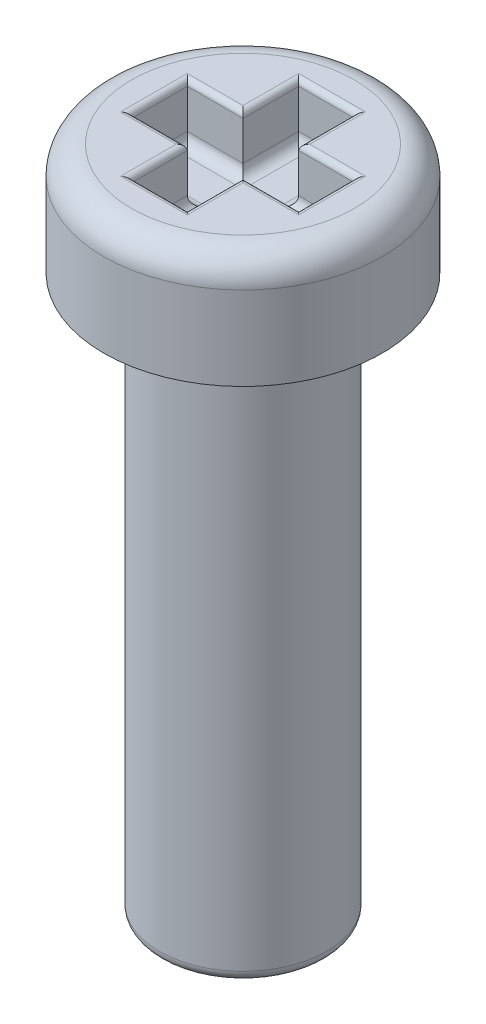
ISO-10303-21;
HEADER;
FILE_DESCRIPTION(('STEP AP214'),'2;1');
FILE_NAME('part.step','',(''),(''),'','','');
FILE_SCHEMA(('AUTOMOTIVE_DESIGN { 1 0 10303 214 1 1 1 1 }'));
ENDSEC;
DATA;
#1=APPLICATION_CONTEXT('core data for automotive mechanical design processes');
#2=APPLICATION_PROTOCOL_DEFINITION('international standard','automotive_design',2000,#1);
#3=PRODUCT_CONTEXT('',#1,'mechanical');
#4=PRODUCT('Part','Part','',(#3));
#5=PRODUCT_RELATED_PRODUCT_CATEGORY('part','',(#4));
#6=PRODUCT_DEFINITION_FORMATION('','',#4);
#7=PRODUCT_DEFINITION_CONTEXT('part definition',#1,'design');
#8=PRODUCT_DEFINITION('design','',#6,#7);
#9=PRODUCT_DEFINITION_SHAPE('','',#8);
#10=(LENGTH_UNIT() NAMED_UNIT(*) SI_UNIT(.MILLI.,.METRE.));
#11=(NAMED_UNIT(*) PLANE_ANGLE_UNIT() SI_UNIT($,.RADIAN.));
#12=(NAMED_UNIT(*) SI_UNIT($,.STERADIAN.) SOLID_ANGLE_UNIT());
#13=UNCERTAINTY_MEASURE_WITH_UNIT(LENGTH_MEASURE(1.E-05),#10,'distance_accuracy_value','');
#14=(GEOMETRIC_REPRESENTATION_CONTEXT(3) GLOBAL_UNCERTAINTY_ASSIGNED_CONTEXT((#13)) GLOBAL_UNIT_ASSIGNED_CONTEXT((#10,
#11,#12)) REPRESENTATION_CONTEXT('',''));
#15=CARTESIAN_POINT('',(0.,0.,0.));
#16=DIRECTION('',(0.,0.,1.));
#17=DIRECTION('',(1.,0.,0.));
#18=AXIS2_PLACEMENT_3D('',#15,#16,#17);
#19=CARTESIAN_POINT('',(0.,10.,0.));
#20=DIRECTION('',(0.,-1.,0.));
#21=DIRECTION('',(0.,0.,-1.));
#22=AXIS2_PLACEMENT_3D('',#19,#20,#21);
#23=CYLINDRICAL_SURFACE('',#22,1.5);
#24=CARTESIAN_POINT('',(0.,0.200000000000001,0.));
#25=DIRECTION('',(0.,1.,0.));
#26=DIRECTION('',(0.,0.,1.));
#27=AXIS2_PLACEMENT_3D('',#24,#25,#26);
#28=CIRCLE('',#27,1.5);
#29=CARTESIAN_POINT('',(0.,0.200000000000001,1.5));
#30=VERTEX_POINT('',#29);
#31=EDGE_CURVE('E255',#30,#30,#28,.T.);
#32=ORIENTED_EDGE('',*,*,#31,.T.);
#33=EDGE_LOOP('',(#32));
#34=FACE_BOUND('',#33,.T.);
#35=CARTESIAN_POINT('',(0.,10.,0.));
#36=DIRECTION('',(0.,1.,0.));
#37=DIRECTION('',(0.,0.,1.));
#38=AXIS2_PLACEMENT_3D('',#35,#36,#37);
#39=CIRCLE('',#38,1.5);
#40=CARTESIAN_POINT('',(0.,10.,1.5));
#41=VERTEX_POINT('',#40);
#42=EDGE_CURVE('E626',#41,#41,#39,.T.);
#43=ORIENTED_EDGE('',*,*,#42,.F.);
#44=EDGE_LOOP('',(#43));
#45=FACE_BOUND('',#44,.T.);
#46=ADVANCED_FACE('F40',(#34,#45),#23,.T.);
#47=CARTESIAN_POINT('',(0.,0.,0.));
#48=DIRECTION('',(0.,1.,0.));
#49=DIRECTION('',(0.,0.,1.));
#50=AXIS2_PLACEMENT_3D('',#47,#48,#49);
#51=PLANE('',#50);
#52=CARTESIAN_POINT('',(0.,0.,0.));
#53=DIRECTION('',(0.,1.,0.));
#54=DIRECTION('',(0.,0.,1.));
#55=AXIS2_PLACEMENT_3D('',#52,#53,#54);
#56=CIRCLE('',#55,1.3);
#57=CARTESIAN_POINT('',(0.,0.,1.3));
#58=VERTEX_POINT('',#57);
#59=EDGE_CURVE('E246',#58,#58,#56,.F.);
#60=ORIENTED_EDGE('',*,*,#59,.T.);
#61=EDGE_LOOP('',(#60));
#62=FACE_BOUND('',#61,.T.);
#63=ADVANCED_FACE('F500',(#62),#51,.F.);
#64=CARTESIAN_POINT('',(0.,0.200000000000001,0.));
#65=DIRECTION('',(0.,1.,0.));
#66=DIRECTION('',(0.,0.,1.));
#67=AXIS2_PLACEMENT_3D('',#64,#65,#66);
#68=TOROIDAL_SURFACE('',#67,1.3,0.2);
#69=ORIENTED_EDGE('',*,*,#59,.F.);
#70=EDGE_LOOP('',(#69));
#71=FACE_BOUND('',#70,.T.);
#72=ORIENTED_EDGE('',*,*,#31,.F.);
#73=EDGE_LOOP('',(#72));
#74=FACE_BOUND('',#73,.T.);
#75=ADVANCED_FACE('F506',(#71,#74),#68,.T.);
#76=CARTESIAN_POINT('',(0.,10.,0.));
#77=DIRECTION('',(0.,1.,0.));
#78=DIRECTION('',(0.,0.,1.));
#79=AXIS2_PLACEMENT_3D('',#76,#77,#78);
#80=PLANE('',#79);
#81=ORIENTED_EDGE('',*,*,#42,.T.);
#82=EDGE_LOOP('',(#81));
#83=FACE_BOUND('',#82,.T.);
#84=CARTESIAN_POINT('',(0.,10.,0.));
#85=DIRECTION('',(0.,-1.,0.));
#86=DIRECTION('',(0.,0.,-1.));
#87=AXIS2_PLACEMENT_3D('',#84,#85,#86);
#88=CIRCLE('',#87,2.5);
#89=CARTESIAN_POINT('',(0.,10.,-2.5));
#90=VERTEX_POINT('',#89);
#91=EDGE_CURVE('E622',#90,#90,#88,.T.);
#92=ORIENTED_EDGE('',*,*,#91,.T.);
#93=EDGE_LOOP('',(#92));
#94=FACE_BOUND('',#93,.T.);
#95=ADVANCED_FACE('F515',(#83,#94),#80,.F.);
#96=CARTESIAN_POINT('',(0.,0.,0.));
#97=DIRECTION('',(0.,-1.,0.));
#98=DIRECTION('',(0.,0.,-1.));
#99=AXIS2_PLACEMENT_3D('',#96,#97,#98);
#100=CYLINDRICAL_SURFACE('',#99,2.5);
#101=CARTESIAN_POINT('',(0.,11.5,0.));
#102=DIRECTION('',(0.,-1.,0.));
#103=DIRECTION('',(0.,0.,-1.));
#104=AXIS2_PLACEMENT_3D('',#101,#102,#103);
#105=CIRCLE('',#104,2.5);
#106=CARTESIAN_POINT('',(0.,11.5,-2.5));
#107=VERTEX_POINT('',#106);
#108=EDGE_CURVE('E49',#107,#107,#105,.T.);
#109=ORIENTED_EDGE('',*,*,#108,.T.);
#110=EDGE_LOOP('',(#109));
#111=FACE_BOUND('',#110,.T.);
#112=ORIENTED_EDGE('',*,*,#91,.F.);
#113=EDGE_LOOP('',(#112));
#114=FACE_BOUND('',#113,.T.);
#115=ADVANCED_FACE('F486',(#111,#114),#100,.T.);
#116=CARTESIAN_POINT('',(-2.5,12.,0.));
#117=DIRECTION('',(0.,-1.,0.));
#118=DIRECTION('',(0.,0.,-1.));
#119=AXIS2_PLACEMENT_3D('',#116,#117,#118);
#120=PLANE('',#119);
#121=CARTESIAN_POINT('',(0.,12.,0.));
#122=DIRECTION('',(0.,-1.,0.));
#123=DIRECTION('',(0.,0.,-1.));
#124=AXIS2_PLACEMENT_3D('',#121,#122,#123);
#125=CIRCLE('',#124,2.);
#126=CARTESIAN_POINT('',(0.,12.,-2.));
#127=VERTEX_POINT('',#126);
#128=EDGE_CURVE('E11',#127,#127,#125,.F.);
#129=ORIENTED_EDGE('',*,*,#128,.T.);
#130=EDGE_LOOP('',(#129));
#131=FACE_BOUND('',#130,.T.);
#132=DIRECTION('',(0.,0.,1.));
#133=VECTOR('',#132,1.);
#134=CARTESIAN_POINT('',(-0.6,12.,0.));
#135=LINE('',#134,#133);
#136=CARTESIAN_POINT('',(-0.6,12.,1.6));
#137=VERTEX_POINT('',#136);
#138=CARTESIAN_POINT('',(-0.6,12.,0.6));
#139=VERTEX_POINT('',#138);
#140=EDGE_CURVE('E284',#137,#139,#135,.F.);
#141=ORIENTED_EDGE('',*,*,#140,.T.);
#142=DIRECTION('',(1.,0.,0.));
#143=VECTOR('',#142,1.);
#144=CARTESIAN_POINT('',(-2.5,12.,0.6));
#145=LINE('',#144,#143);
#146=CARTESIAN_POINT('',(-1.6,12.,0.6));
#147=VERTEX_POINT('',#146);
#148=EDGE_CURVE('E227',#139,#147,#145,.F.);
#149=ORIENTED_EDGE('',*,*,#148,.T.);
#150=DIRECTION('',(0.,0.,1.));
#151=VECTOR('',#150,1.);
#152=CARTESIAN_POINT('',(-1.6,12.,0.));
#153=LINE('',#152,#151);
#154=CARTESIAN_POINT('',(-1.6,12.,-0.6));
#155=VERTEX_POINT('',#154);
#156=EDGE_CURVE('E245',#147,#155,#153,.F.);
#157=ORIENTED_EDGE('',*,*,#156,.T.);
#158=DIRECTION('',(-1.,0.,0.));
#159=VECTOR('',#158,1.);
#160=CARTESIAN_POINT('',(-2.5,12.,-0.6));
#161=LINE('',#160,#159);
#162=CARTESIAN_POINT('',(-0.6,12.,-0.6));
#163=VERTEX_POINT('',#162);
#164=EDGE_CURVE('E251',#155,#163,#161,.F.);
#165=ORIENTED_EDGE('',*,*,#164,.T.);
#166=DIRECTION('',(0.,0.,1.));
#167=VECTOR('',#166,1.);
#168=CARTESIAN_POINT('',(-0.6,12.,0.));
#169=LINE('',#168,#167);
#170=CARTESIAN_POINT('',(-0.6,12.,-1.6));
#171=VERTEX_POINT('',#170);
#172=EDGE_CURVE('E261',#163,#171,#169,.F.);
#173=ORIENTED_EDGE('',*,*,#172,.T.);
#174=DIRECTION('',(-1.,0.,0.));
#175=VECTOR('',#174,1.);
#176=CARTESIAN_POINT('',(-2.5,12.,-1.6));
#177=LINE('',#176,#175);
#178=CARTESIAN_POINT('',(0.6,12.,-1.6));
#179=VERTEX_POINT('',#178);
#180=EDGE_CURVE('E264',#171,#179,#177,.F.);
#181=ORIENTED_EDGE('',*,*,#180,.T.);
#182=DIRECTION('',(0.,0.,-1.));
#183=VECTOR('',#182,1.);
#184=CARTESIAN_POINT('',(0.6,12.,0.));
#185=LINE('',#184,#183);
#186=CARTESIAN_POINT('',(0.6,12.,-0.6));
#187=VERTEX_POINT('',#186);
#188=EDGE_CURVE('E266',#179,#187,#185,.F.);
#189=ORIENTED_EDGE('',*,*,#188,.T.);
#190=DIRECTION('',(-1.,0.,0.));
#191=VECTOR('',#190,1.);
#192=CARTESIAN_POINT('',(-2.5,12.,-0.599999999999999));
#193=LINE('',#192,#191);
#194=CARTESIAN_POINT('',(1.6,12.,-0.6));
#195=VERTEX_POINT('',#194);
#196=EDGE_CURVE('E269',#187,#195,#193,.F.);
#197=ORIENTED_EDGE('',*,*,#196,.T.);
#198=DIRECTION('',(0.,0.,-1.));
#199=VECTOR('',#198,1.);
#200=CARTESIAN_POINT('',(1.6,12.,0.));
#201=LINE('',#200,#199);
#202=CARTESIAN_POINT('',(1.6,12.,0.6));
#203=VERTEX_POINT('',#202);
#204=EDGE_CURVE('E272',#195,#203,#201,.F.);
#205=ORIENTED_EDGE('',*,*,#204,.T.);
#206=DIRECTION('',(1.,0.,0.));
#207=VECTOR('',#206,1.);
#208=CARTESIAN_POINT('',(-2.5,12.,0.6));
#209=LINE('',#208,#207);
#210=CARTESIAN_POINT('',(0.6,12.,0.6));
#211=VERTEX_POINT('',#210);
#212=EDGE_CURVE('E275',#203,#211,#209,.F.);
#213=ORIENTED_EDGE('',*,*,#212,.T.);
#214=DIRECTION('',(0.,0.,-1.));
#215=VECTOR('',#214,1.);
#216=CARTESIAN_POINT('',(0.6,12.,0.));
#217=LINE('',#216,#215);
#218=CARTESIAN_POINT('',(0.6,12.,1.6));
#219=VERTEX_POINT('',#218);
#220=EDGE_CURVE('E278',#211,#219,#217,.F.);
#221=ORIENTED_EDGE('',*,*,#220,.T.);
#222=DIRECTION('',(1.,0.,0.));
#223=VECTOR('',#222,1.);
#224=CARTESIAN_POINT('',(-2.5,12.,1.6));
#225=LINE('',#224,#223);
#226=EDGE_CURVE('E281',#219,#137,#225,.F.);
#227=ORIENTED_EDGE('',*,*,#226,.T.);
#228=EDGE_LOOP('',(#141,#149,#157,#165,#173,#181,#189,#197,#205,#213,#221,#227));
#229=FACE_BOUND('',#228,.T.);
#230=ADVANCED_FACE('F667',(#131,#229),#120,.F.);
#231=CARTESIAN_POINT('',(0.5,11.,0.5));
#232=DIRECTION('',(1.,0.,0.));
#233=DIRECTION('',(0.,0.,-1.));
#234=AXIS2_PLACEMENT_3D('',#231,#232,#233);
#235=PLANE('',#234);
#236=DIRECTION('',(0.,1.,0.));
#237=VECTOR('',#236,1.);
#238=CARTESIAN_POINT('',(0.5,11.,0.5));
#239=LINE('',#238,#237);
#240=CARTESIAN_POINT('',(0.5,11.2,0.5));
#241=VERTEX_POINT('',#240);
#242=CARTESIAN_POINT('',(0.5,11.9,0.5));
#243=VERTEX_POINT('',#242);
#244=EDGE_CURVE('E367',#241,#243,#239,.T.);
#245=ORIENTED_EDGE('',*,*,#244,.F.);
#246=DIRECTION('',(0.,0.,-1.));
#247=VECTOR('',#246,1.);
#248=CARTESIAN_POINT('',(0.5,11.2,0.5));
#249=LINE('',#248,#247);
#250=CARTESIAN_POINT('',(0.5,11.2,1.5));
#251=VERTEX_POINT('',#250);
#252=EDGE_CURVE('E416',#241,#251,#249,.F.);
#253=ORIENTED_EDGE('',*,*,#252,.T.);
#254=DIRECTION('',(0.,1.,0.));
#255=VECTOR('',#254,1.);
#256=CARTESIAN_POINT('',(0.5,11.,1.5));
#257=LINE('',#256,#255);
#258=CARTESIAN_POINT('',(0.5,11.9,1.5));
#259=VERTEX_POINT('',#258);
#260=EDGE_CURVE('E617',#251,#259,#257,.T.);
#261=ORIENTED_EDGE('',*,*,#260,.T.);
#262=DIRECTION('',(0.,0.,-1.));
#263=VECTOR('',#262,1.);
#264=CARTESIAN_POINT('',(0.5,11.9,0.5));
#265=LINE('',#264,#263);
#266=EDGE_CURVE('E292',#259,#243,#265,.T.);
#267=ORIENTED_EDGE('',*,*,#266,.T.);
#268=EDGE_LOOP('',(#245,#253,#261,#267));
#269=FACE_BOUND('',#268,.T.);
#270=ADVANCED_FACE('F616',(#269),#235,.F.);
#271=CARTESIAN_POINT('',(-0.5,11.,1.5));
#272=DIRECTION('',(0.,0.,1.));
#273=DIRECTION('',(1.,0.,0.));
#274=AXIS2_PLACEMENT_3D('',#271,#272,#273);
#275=PLANE('',#274);
#276=ORIENTED_EDGE('',*,*,#260,.F.);
#277=DIRECTION('',(1.,0.,0.));
#278=VECTOR('',#277,1.);
#279=CARTESIAN_POINT('',(-0.5,11.2,1.5));
#280=LINE('',#279,#278);
#281=CARTESIAN_POINT('',(-0.5,11.2,1.5));
#282=VERTEX_POINT('',#281);
#283=EDGE_CURVE('E419',#251,#282,#280,.F.);
#284=ORIENTED_EDGE('',*,*,#283,.T.);
#285=DIRECTION('',(0.,1.,0.));
#286=VECTOR('',#285,1.);
#287=CARTESIAN_POINT('',(-0.5,11.,1.5));
#288=LINE('',#287,#286);
#289=CARTESIAN_POINT('',(-0.5,11.9,1.5));
#290=VERTEX_POINT('',#289);
#291=EDGE_CURVE('E216',#282,#290,#288,.T.);
#292=ORIENTED_EDGE('',*,*,#291,.T.);
#293=DIRECTION('',(1.,0.,0.));
#294=VECTOR('',#293,1.);
#295=CARTESIAN_POINT('',(-0.5,11.9,1.5));
#296=LINE('',#295,#294);
#297=EDGE_CURVE('E239',#290,#259,#296,.T.);
#298=ORIENTED_EDGE('',*,*,#297,.T.);
#299=EDGE_LOOP('',(#276,#284,#292,#298));
#300=FACE_BOUND('',#299,.T.);
#301=ADVANCED_FACE('F619',(#300),#275,.F.);
#302=CARTESIAN_POINT('',(-0.5,11.,0.5));
#303=DIRECTION('',(-1.,0.,0.));
#304=DIRECTION('',(0.,0.,1.));
#305=AXIS2_PLACEMENT_3D('',#302,#303,#304);
#306=PLANE('',#305);
#307=ORIENTED_EDGE('',*,*,#291,.F.);
#308=DIRECTION('',(0.,0.,1.));
#309=VECTOR('',#308,1.);
#310=CARTESIAN_POINT('',(-0.5,11.2,0.5));
#311=LINE('',#310,#309);
#312=CARTESIAN_POINT('',(-0.5,11.2,0.5));
#313=VERTEX_POINT('',#312);
#314=EDGE_CURVE('E211',#282,#313,#311,.F.);
#315=ORIENTED_EDGE('',*,*,#314,.T.);
#316=DIRECTION('',(0.,1.,0.));
#317=VECTOR('',#316,1.);
#318=CARTESIAN_POINT('',(-0.5,11.,0.5));
#319=LINE('',#318,#317);
#320=CARTESIAN_POINT('',(-0.5,11.9,0.5));
#321=VERTEX_POINT('',#320);
#322=EDGE_CURVE('E203',#313,#321,#319,.T.);
#323=ORIENTED_EDGE('',*,*,#322,.T.);
#324=DIRECTION('',(0.,0.,1.));
#325=VECTOR('',#324,1.);
#326=CARTESIAN_POINT('',(-0.5,11.9,0.5));
#327=LINE('',#326,#325);
#328=EDGE_CURVE('E208',#321,#290,#327,.T.);
#329=ORIENTED_EDGE('',*,*,#328,.T.);
#330=EDGE_LOOP('',(#307,#315,#323,#329));
#331=FACE_BOUND('',#330,.T.);
#332=ADVANCED_FACE('F206',(#331),#306,.F.);
#333=CARTESIAN_POINT('',(-0.5,11.,0.5));
#334=DIRECTION('',(0.,0.,1.));
#335=DIRECTION('',(1.,0.,0.));
#336=AXIS2_PLACEMENT_3D('',#333,#334,#335);
#337=PLANE('',#336);
#338=ORIENTED_EDGE('',*,*,#322,.F.);
#339=DIRECTION('',(1.,0.,0.));
#340=VECTOR('',#339,1.);
#341=CARTESIAN_POINT('',(-0.5,11.2,0.5));
#342=LINE('',#341,#340);
#343=CARTESIAN_POINT('',(-1.5,11.2,0.5));
#344=VERTEX_POINT('',#343);
#345=EDGE_CURVE('E411',#313,#344,#342,.F.);
#346=ORIENTED_EDGE('',*,*,#345,.T.);
#347=DIRECTION('',(0.,1.,0.));
#348=VECTOR('',#347,1.);
#349=CARTESIAN_POINT('',(-1.5,11.,0.5));
#350=LINE('',#349,#348);
#351=CARTESIAN_POINT('',(-1.5,11.9,0.5));
#352=VERTEX_POINT('',#351);
#353=EDGE_CURVE('E217',#344,#352,#350,.T.);
#354=ORIENTED_EDGE('',*,*,#353,.T.);
#355=DIRECTION('',(1.,0.,0.));
#356=VECTOR('',#355,1.);
#357=CARTESIAN_POINT('',(-0.5,11.9,0.5));
#358=LINE('',#357,#356);
#359=EDGE_CURVE('E225',#352,#321,#358,.T.);
#360=ORIENTED_EDGE('',*,*,#359,.T.);
#361=EDGE_LOOP('',(#338,#346,#354,#360));
#362=FACE_BOUND('',#361,.T.);
#363=ADVANCED_FACE('F241',(#362),#337,.F.);
#364=CARTESIAN_POINT('',(-1.5,11.,-0.5));
#365=DIRECTION('',(-1.,0.,0.));
#366=DIRECTION('',(0.,0.,1.));
#367=AXIS2_PLACEMENT_3D('',#364,#365,#366);
#368=PLANE('',#367);
#369=ORIENTED_EDGE('',*,*,#353,.F.);
#370=DIRECTION('',(0.,0.,1.));
#371=VECTOR('',#370,1.);
#372=CARTESIAN_POINT('',(-1.5,11.2,-0.5));
#373=LINE('',#372,#371);
#374=CARTESIAN_POINT('',(-1.5,11.2,-0.5));
#375=VERTEX_POINT('',#374);
#376=EDGE_CURVE('E408',#344,#375,#373,.F.);
#377=ORIENTED_EDGE('',*,*,#376,.T.);
#378=DIRECTION('',(0.,1.,0.));
#379=VECTOR('',#378,1.);
#380=CARTESIAN_POINT('',(-1.5,11.,-0.5));
#381=LINE('',#380,#379);
#382=CARTESIAN_POINT('',(-1.5,11.9,-0.5));
#383=VERTEX_POINT('',#382);
#384=EDGE_CURVE('E633',#375,#383,#381,.T.);
#385=ORIENTED_EDGE('',*,*,#384,.T.);
#386=DIRECTION('',(0.,0.,1.));
#387=VECTOR('',#386,1.);
#388=CARTESIAN_POINT('',(-1.5,11.9,-0.5));
#389=LINE('',#388,#387);
#390=EDGE_CURVE('E323',#383,#352,#389,.T.);
#391=ORIENTED_EDGE('',*,*,#390,.T.);
#392=EDGE_LOOP('',(#369,#377,#385,#391));
#393=FACE_BOUND('',#392,.T.);
#394=ADVANCED_FACE('F702',(#393),#368,.F.);
#395=CARTESIAN_POINT('',(-0.5,11.,-0.5));
#396=DIRECTION('',(0.,0.,-1.));
#397=DIRECTION('',(-1.,0.,0.));
#398=AXIS2_PLACEMENT_3D('',#395,#396,#397);
#399=PLANE('',#398);
#400=ORIENTED_EDGE('',*,*,#384,.F.);
#401=DIRECTION('',(-1.,0.,0.));
#402=VECTOR('',#401,1.);
#403=CARTESIAN_POINT('',(-0.5,11.2,-0.5));
#404=LINE('',#403,#402);
#405=CARTESIAN_POINT('',(-0.5,11.2,-0.5));
#406=VERTEX_POINT('',#405);
#407=EDGE_CURVE('E404',#375,#406,#404,.F.);
#408=ORIENTED_EDGE('',*,*,#407,.T.);
#409=DIRECTION('',(0.,1.,0.));
#410=VECTOR('',#409,1.);
#411=CARTESIAN_POINT('',(-0.5,11.,-0.5));
#412=LINE('',#411,#410);
#413=CARTESIAN_POINT('',(-0.5,11.9,-0.5));
#414=VERTEX_POINT('',#413);
#415=EDGE_CURVE('E636',#406,#414,#412,.T.);
#416=ORIENTED_EDGE('',*,*,#415,.T.);
#417=DIRECTION('',(-1.,0.,0.));
#418=VECTOR('',#417,1.);
#419=CARTESIAN_POINT('',(-0.5,11.9,-0.5));
#420=LINE('',#419,#418);
#421=EDGE_CURVE('E319',#414,#383,#420,.T.);
#422=ORIENTED_EDGE('',*,*,#421,.T.);
#423=EDGE_LOOP('',(#400,#408,#416,#422));
#424=FACE_BOUND('',#423,.T.);
#425=ADVANCED_FACE('F699',(#424),#399,.F.);
#426=CARTESIAN_POINT('',(-0.5,11.,-1.5));
#427=DIRECTION('',(-1.,0.,0.));
#428=DIRECTION('',(0.,0.,1.));
#429=AXIS2_PLACEMENT_3D('',#426,#427,#428);
#430=PLANE('',#429);
#431=ORIENTED_EDGE('',*,*,#415,.F.);
#432=DIRECTION('',(0.,0.,1.));
#433=VECTOR('',#432,1.);
#434=CARTESIAN_POINT('',(-0.5,11.2,-1.5));
#435=LINE('',#434,#433);
#436=CARTESIAN_POINT('',(-0.5,11.2,-1.5));
#437=VERTEX_POINT('',#436);
#438=EDGE_CURVE('E56',#406,#437,#435,.F.);
#439=ORIENTED_EDGE('',*,*,#438,.T.);
#440=DIRECTION('',(0.,1.,0.));
#441=VECTOR('',#440,1.);
#442=CARTESIAN_POINT('',(-0.5,11.,-1.5));
#443=LINE('',#442,#441);
#444=CARTESIAN_POINT('',(-0.5,11.9,-1.5));
#445=VERTEX_POINT('',#444);
#446=EDGE_CURVE('E639',#437,#445,#443,.T.);
#447=ORIENTED_EDGE('',*,*,#446,.T.);
#448=DIRECTION('',(0.,0.,1.));
#449=VECTOR('',#448,1.);
#450=CARTESIAN_POINT('',(-0.5,11.9,-1.5));
#451=LINE('',#450,#449);
#452=EDGE_CURVE('E315',#445,#414,#451,.T.);
#453=ORIENTED_EDGE('',*,*,#452,.T.);
#454=EDGE_LOOP('',(#431,#439,#447,#453));
#455=FACE_BOUND('',#454,.T.);
#456=ADVANCED_FACE('F696',(#455),#430,.F.);
#457=CARTESIAN_POINT('',(-0.5,11.,-1.5));
#458=DIRECTION('',(0.,0.,-1.));
#459=DIRECTION('',(-1.,0.,0.));
#460=AXIS2_PLACEMENT_3D('',#457,#458,#459);
#461=PLANE('',#460);
#462=ORIENTED_EDGE('',*,*,#446,.F.);
#463=DIRECTION('',(-1.,0.,0.));
#464=VECTOR('',#463,1.);
#465=CARTESIAN_POINT('',(-0.5,11.2,-1.5));
#466=LINE('',#465,#464);
#467=CARTESIAN_POINT('',(0.5,11.2,-1.5));
#468=VERTEX_POINT('',#467);
#469=EDGE_CURVE('E63',#437,#468,#466,.F.);
#470=ORIENTED_EDGE('',*,*,#469,.T.);
#471=DIRECTION('',(0.,1.,0.));
#472=VECTOR('',#471,1.);
#473=CARTESIAN_POINT('',(0.5,11.,-1.5));
#474=LINE('',#473,#472);
#475=CARTESIAN_POINT('',(0.5,11.9,-1.5));
#476=VERTEX_POINT('',#475);
#477=EDGE_CURVE('E642',#468,#476,#474,.T.);
#478=ORIENTED_EDGE('',*,*,#477,.T.);
#479=DIRECTION('',(-1.,0.,0.));
#480=VECTOR('',#479,1.);
#481=CARTESIAN_POINT('',(-0.5,11.9,-1.5));
#482=LINE('',#481,#480);
#483=EDGE_CURVE('E311',#476,#445,#482,.T.);
#484=ORIENTED_EDGE('',*,*,#483,.T.);
#485=EDGE_LOOP('',(#462,#470,#478,#484));
#486=FACE_BOUND('',#485,.T.);
#487=ADVANCED_FACE('F692',(#486),#461,.F.);
#488=CARTESIAN_POINT('',(0.5,11.,-1.5));
#489=DIRECTION('',(1.,0.,0.));
#490=DIRECTION('',(0.,0.,-1.));
#491=AXIS2_PLACEMENT_3D('',#488,#489,#490);
#492=PLANE('',#491);
#493=ORIENTED_EDGE('',*,*,#477,.F.);
#494=DIRECTION('',(0.,0.,-1.));
#495=VECTOR('',#494,1.);
#496=CARTESIAN_POINT('',(0.5,11.2,-1.5));
#497=LINE('',#496,#495);
#498=CARTESIAN_POINT('',(0.5,11.2,-0.5));
#499=VERTEX_POINT('',#498);
#500=EDGE_CURVE('E431',#468,#499,#497,.F.);
#501=ORIENTED_EDGE('',*,*,#500,.T.);
#502=DIRECTION('',(0.,1.,0.));
#503=VECTOR('',#502,1.);
#504=CARTESIAN_POINT('',(0.5,11.,-0.5));
#505=LINE('',#504,#503);
#506=CARTESIAN_POINT('',(0.5,11.9,-0.5));
#507=VERTEX_POINT('',#506);
#508=EDGE_CURVE('E645',#499,#507,#505,.T.);
#509=ORIENTED_EDGE('',*,*,#508,.T.);
#510=DIRECTION('',(0.,0.,-1.));
#511=VECTOR('',#510,1.);
#512=CARTESIAN_POINT('',(0.5,11.9,-1.5));
#513=LINE('',#512,#511);
#514=EDGE_CURVE('E307',#507,#476,#513,.T.);
#515=ORIENTED_EDGE('',*,*,#514,.T.);
#516=EDGE_LOOP('',(#493,#501,#509,#515));
#517=FACE_BOUND('',#516,.T.);
#518=ADVANCED_FACE('F688',(#517),#492,.F.);
#519=CARTESIAN_POINT('',(1.5,11.,-0.5));
#520=DIRECTION('',(0.,0.,-1.));
#521=DIRECTION('',(-1.,0.,0.));
#522=AXIS2_PLACEMENT_3D('',#519,#520,#521);
#523=PLANE('',#522);
#524=ORIENTED_EDGE('',*,*,#508,.F.);
#525=DIRECTION('',(-1.,0.,0.));
#526=VECTOR('',#525,1.);
#527=CARTESIAN_POINT('',(1.5,11.2,-0.5));
#528=LINE('',#527,#526);
#529=CARTESIAN_POINT('',(1.5,11.2,-0.5));
#530=VERTEX_POINT('',#529);
#531=EDGE_CURVE('E428',#499,#530,#528,.F.);
#532=ORIENTED_EDGE('',*,*,#531,.T.);
#533=DIRECTION('',(0.,1.,0.));
#534=VECTOR('',#533,1.);
#535=CARTESIAN_POINT('',(1.5,11.,-0.5));
#536=LINE('',#535,#534);
#537=CARTESIAN_POINT('',(1.5,11.9,-0.5));
#538=VERTEX_POINT('',#537);
#539=EDGE_CURVE('E648',#530,#538,#536,.T.);
#540=ORIENTED_EDGE('',*,*,#539,.T.);
#541=DIRECTION('',(-1.,0.,0.));
#542=VECTOR('',#541,1.);
#543=CARTESIAN_POINT('',(1.5,11.9,-0.5));
#544=LINE('',#543,#542);
#545=EDGE_CURVE('E303',#538,#507,#544,.T.);
#546=ORIENTED_EDGE('',*,*,#545,.T.);
#547=EDGE_LOOP('',(#524,#532,#540,#546));
#548=FACE_BOUND('',#547,.T.);
#549=ADVANCED_FACE('F684',(#548),#523,.F.);
#550=CARTESIAN_POINT('',(1.5,11.,-0.5));
#551=DIRECTION('',(1.,0.,0.));
#552=DIRECTION('',(0.,0.,-1.));
#553=AXIS2_PLACEMENT_3D('',#550,#551,#552);
#554=PLANE('',#553);
#555=ORIENTED_EDGE('',*,*,#539,.F.);
#556=DIRECTION('',(0.,0.,-1.));
#557=VECTOR('',#556,1.);
#558=CARTESIAN_POINT('',(1.5,11.2,-0.5));
#559=LINE('',#558,#557);
#560=CARTESIAN_POINT('',(1.5,11.2,0.5));
#561=VERTEX_POINT('',#560);
#562=EDGE_CURVE('E425',#530,#561,#559,.F.);
#563=ORIENTED_EDGE('',*,*,#562,.T.);
#564=DIRECTION('',(0.,1.,0.));
#565=VECTOR('',#564,1.);
#566=CARTESIAN_POINT('',(1.5,11.,0.5));
#567=LINE('',#566,#565);
#568=CARTESIAN_POINT('',(1.5,11.9,0.5));
#569=VERTEX_POINT('',#568);
#570=EDGE_CURVE('E651',#561,#569,#567,.T.);
#571=ORIENTED_EDGE('',*,*,#570,.T.);
#572=DIRECTION('',(0.,0.,-1.));
#573=VECTOR('',#572,1.);
#574=CARTESIAN_POINT('',(1.5,11.9,-0.5));
#575=LINE('',#574,#573);
#576=EDGE_CURVE('E299',#569,#538,#575,.T.);
#577=ORIENTED_EDGE('',*,*,#576,.T.);
#578=EDGE_LOOP('',(#555,#563,#571,#577));
#579=FACE_BOUND('',#578,.T.);
#580=ADVANCED_FACE('F680',(#579),#554,.F.);
#581=CARTESIAN_POINT('',(1.5,11.,0.5));
#582=DIRECTION('',(0.,0.,1.));
#583=DIRECTION('',(1.,0.,0.));
#584=AXIS2_PLACEMENT_3D('',#581,#582,#583);
#585=PLANE('',#584);
#586=ORIENTED_EDGE('',*,*,#570,.F.);
#587=DIRECTION('',(1.,0.,0.));
#588=VECTOR('',#587,1.);
#589=CARTESIAN_POINT('',(1.5,11.2,0.5));
#590=LINE('',#589,#588);
#591=EDGE_CURVE('E422',#561,#241,#590,.F.);
#592=ORIENTED_EDGE('',*,*,#591,.T.);
#593=ORIENTED_EDGE('',*,*,#244,.T.);
#594=DIRECTION('',(1.,0.,0.));
#595=VECTOR('',#594,1.);
#596=CARTESIAN_POINT('',(1.5,11.9,0.5));
#597=LINE('',#596,#595);
#598=EDGE_CURVE('E296',#243,#569,#597,.T.);
#599=ORIENTED_EDGE('',*,*,#598,.T.);
#600=EDGE_LOOP('',(#586,#592,#593,#599));
#601=FACE_BOUND('',#600,.T.);
#602=ADVANCED_FACE('F677',(#601),#585,.F.);
#603=CARTESIAN_POINT('',(0.,11.,0.));
#604=DIRECTION('',(0.,1.,0.));
#605=DIRECTION('',(0.,0.,1.));
#606=AXIS2_PLACEMENT_3D('',#603,#604,#605);
#607=PLANE('',#606);
#608=DIRECTION('',(-1.,0.,0.));
#609=VECTOR('',#608,1.);
#610=CARTESIAN_POINT('',(0.,11.,-0.3));
#611=LINE('',#610,#609);
#612=CARTESIAN_POINT('',(-0.3,11.,-0.3));
#613=VERTEX_POINT('',#612);
#614=CARTESIAN_POINT('',(-1.3,11.,-0.3));
#615=VERTEX_POINT('',#614);
#616=EDGE_CURVE('E388',#613,#615,#611,.T.);
#617=ORIENTED_EDGE('',*,*,#616,.T.);
#618=DIRECTION('',(0.,0.,1.));
#619=VECTOR('',#618,1.);
#620=CARTESIAN_POINT('',(-1.3,11.,0.));
#621=LINE('',#620,#619);
#622=CARTESIAN_POINT('',(-1.3,11.,0.3));
#623=VERTEX_POINT('',#622);
#624=EDGE_CURVE('E401',#615,#623,#621,.T.);
#625=ORIENTED_EDGE('',*,*,#624,.T.);
#626=DIRECTION('',(1.,0.,0.));
#627=VECTOR('',#626,1.);
#628=CARTESIAN_POINT('',(0.,11.,0.3));
#629=LINE('',#628,#627);
#630=CARTESIAN_POINT('',(-0.3,11.,0.3));
#631=VERTEX_POINT('',#630);
#632=EDGE_CURVE('E398',#623,#631,#629,.T.);
#633=ORIENTED_EDGE('',*,*,#632,.T.);
#634=DIRECTION('',(0.,0.,1.));
#635=VECTOR('',#634,1.);
#636=CARTESIAN_POINT('',(-0.3,11.,0.));
#637=LINE('',#636,#635);
#638=CARTESIAN_POINT('',(-0.3,11.,1.3));
#639=VERTEX_POINT('',#638);
#640=EDGE_CURVE('E395',#631,#639,#637,.T.);
#641=ORIENTED_EDGE('',*,*,#640,.T.);
#642=DIRECTION('',(1.,0.,0.));
#643=VECTOR('',#642,1.);
#644=CARTESIAN_POINT('',(0.,11.,1.3));
#645=LINE('',#644,#643);
#646=CARTESIAN_POINT('',(0.3,11.,1.3));
#647=VERTEX_POINT('',#646);
#648=EDGE_CURVE('E392',#639,#647,#645,.T.);
#649=ORIENTED_EDGE('',*,*,#648,.T.);
#650=DIRECTION('',(0.,0.,-1.));
#651=VECTOR('',#650,1.);
#652=CARTESIAN_POINT('',(0.3,11.,0.));
#653=LINE('',#652,#651);
#654=CARTESIAN_POINT('',(0.3,11.,0.3));
#655=VERTEX_POINT('',#654);
#656=EDGE_CURVE('E385',#647,#655,#653,.T.);
#657=ORIENTED_EDGE('',*,*,#656,.T.);
#658=DIRECTION('',(1.,0.,0.));
#659=VECTOR('',#658,1.);
#660=CARTESIAN_POINT('',(0.,11.,0.3));
#661=LINE('',#660,#659);
#662=CARTESIAN_POINT('',(1.3,11.,0.3));
#663=VERTEX_POINT('',#662);
#664=EDGE_CURVE('E382',#655,#663,#661,.T.);
#665=ORIENTED_EDGE('',*,*,#664,.T.);
#666=DIRECTION('',(0.,0.,-1.));
#667=VECTOR('',#666,1.);
#668=CARTESIAN_POINT('',(1.3,11.,0.));
#669=LINE('',#668,#667);
#670=CARTESIAN_POINT('',(1.3,11.,-0.3));
#671=VERTEX_POINT('',#670);
#672=EDGE_CURVE('E379',#663,#671,#669,.T.);
#673=ORIENTED_EDGE('',*,*,#672,.T.);
#674=DIRECTION('',(-1.,0.,0.));
#675=VECTOR('',#674,1.);
#676=CARTESIAN_POINT('',(0.,11.,-0.3));
#677=LINE('',#676,#675);
#678=CARTESIAN_POINT('',(0.3,11.,-0.3));
#679=VERTEX_POINT('',#678);
#680=EDGE_CURVE('E376',#671,#679,#677,.T.);
#681=ORIENTED_EDGE('',*,*,#680,.T.);
#682=DIRECTION('',(0.,0.,-1.));
#683=VECTOR('',#682,1.);
#684=CARTESIAN_POINT('',(0.3,11.,0.));
#685=LINE('',#684,#683);
#686=CARTESIAN_POINT('',(0.3,11.,-1.3));
#687=VERTEX_POINT('',#686);
#688=EDGE_CURVE('E373',#679,#687,#685,.T.);
#689=ORIENTED_EDGE('',*,*,#688,.T.);
#690=DIRECTION('',(-1.,0.,0.));
#691=VECTOR('',#690,1.);
#692=CARTESIAN_POINT('',(0.,11.,-1.3));
#693=LINE('',#692,#691);
#694=CARTESIAN_POINT('',(-0.3,11.,-1.3));
#695=VERTEX_POINT('',#694);
#696=EDGE_CURVE('E370',#687,#695,#693,.T.);
#697=ORIENTED_EDGE('',*,*,#696,.T.);
#698=DIRECTION('',(0.,0.,1.));
#699=VECTOR('',#698,1.);
#700=CARTESIAN_POINT('',(-0.3,11.,0.));
#701=LINE('',#700,#699);
#702=EDGE_CURVE('E325',#695,#613,#701,.T.);
#703=ORIENTED_EDGE('',*,*,#702,.T.);
#704=EDGE_LOOP('',(#617,#625,#633,#641,#649,#657,#665,#673,#681,#689,#697,#703));
#705=FACE_BOUND('',#704,.T.);
#706=ADVANCED_FACE('F560',(#705),#607,.T.);
#707=CARTESIAN_POINT('',(1.5,11.9,-0.6));
#708=DIRECTION('',(-1.,0.,0.));
#709=DIRECTION('',(0.,0.,1.));
#710=AXIS2_PLACEMENT_3D('',#707,#708,#709);
#711=CYLINDRICAL_SURFACE('',#710,0.1);
#712=CARTESIAN_POINT('',(1.6,11.9,-0.6));
#713=DIRECTION('',(-0.707106781186548,0.,-0.707106781186547));
#714=DIRECTION('',(0.707106781186547,0.,-0.707106781186548));
#715=AXIS2_PLACEMENT_3D('',#712,#713,#714);
#716=ELLIPSE('',#715,0.14142135623731,0.1);
#717=EDGE_CURVE('E359',#195,#538,#716,.F.);
#718=ORIENTED_EDGE('',*,*,#717,.F.);
#719=ORIENTED_EDGE('',*,*,#196,.F.);
#720=CARTESIAN_POINT('',(0.6,11.9,-0.6));
#721=DIRECTION('',(-0.707106781186548,0.,-0.707106781186547));
#722=DIRECTION('',(0.707106781186547,0.,-0.707106781186548));
#723=AXIS2_PLACEMENT_3D('',#720,#721,#722);
#724=ELLIPSE('',#723,0.14142135623731,0.1);
#725=EDGE_CURVE('E363',#507,#187,#724,.T.);
#726=ORIENTED_EDGE('',*,*,#725,.F.);
#727=ORIENTED_EDGE('',*,*,#545,.F.);
#728=EDGE_LOOP('',(#718,#719,#726,#727));
#729=FACE_BOUND('',#728,.T.);
#730=ADVANCED_FACE('F557',(#729),#711,.T.);
#731=CARTESIAN_POINT('',(0.6,11.9,-1.5));
#732=DIRECTION('',(0.,0.,-1.));
#733=DIRECTION('',(-1.,0.,0.));
#734=AXIS2_PLACEMENT_3D('',#731,#732,#733);
#735=CYLINDRICAL_SURFACE('',#734,0.1);
#736=ORIENTED_EDGE('',*,*,#725,.T.);
#737=ORIENTED_EDGE('',*,*,#188,.F.);
#738=CARTESIAN_POINT('',(0.6,11.9,-1.6));
#739=DIRECTION('',(-0.707106781186548,0.,-0.707106781186547));
#740=DIRECTION('',(0.707106781186547,0.,-0.707106781186548));
#741=AXIS2_PLACEMENT_3D('',#738,#739,#740);
#742=ELLIPSE('',#741,0.14142135623731,0.1);
#743=EDGE_CURVE('E355',#476,#179,#742,.T.);
#744=ORIENTED_EDGE('',*,*,#743,.F.);
#745=ORIENTED_EDGE('',*,*,#514,.F.);
#746=EDGE_LOOP('',(#736,#737,#744,#745));
#747=FACE_BOUND('',#746,.T.);
#748=ADVANCED_FACE('F553',(#747),#735,.T.);
#749=CARTESIAN_POINT('',(1.6,11.9,-0.5));
#750=DIRECTION('',(0.,0.,-1.));
#751=DIRECTION('',(-1.,0.,0.));
#752=AXIS2_PLACEMENT_3D('',#749,#750,#751);
#753=CYLINDRICAL_SURFACE('',#752,0.1);
#754=ORIENTED_EDGE('',*,*,#717,.T.);
#755=ORIENTED_EDGE('',*,*,#576,.F.);
#756=CARTESIAN_POINT('',(1.6,11.9,0.6));
#757=DIRECTION('',(0.707106781186547,0.,-0.707106781186547));
#758=DIRECTION('',(0.707106781186547,0.,0.707106781186547));
#759=AXIS2_PLACEMENT_3D('',#756,#757,#758);
#760=ELLIPSE('',#759,0.14142135623731,0.1);
#761=EDGE_CURVE('E351',#203,#569,#760,.F.);
#762=ORIENTED_EDGE('',*,*,#761,.F.);
#763=ORIENTED_EDGE('',*,*,#204,.F.);
#764=EDGE_LOOP('',(#754,#755,#762,#763));
#765=FACE_BOUND('',#764,.T.);
#766=ADVANCED_FACE('F549',(#765),#753,.T.);
#767=CARTESIAN_POINT('',(-0.5,11.9,-1.6));
#768=DIRECTION('',(-1.,0.,0.));
#769=DIRECTION('',(0.,0.,1.));
#770=AXIS2_PLACEMENT_3D('',#767,#768,#769);
#771=CYLINDRICAL_SURFACE('',#770,0.1);
#772=ORIENTED_EDGE('',*,*,#743,.T.);
#773=ORIENTED_EDGE('',*,*,#180,.F.);
#774=CARTESIAN_POINT('',(-0.6,11.9,-1.6));
#775=DIRECTION('',(-0.707106781186547,0.,0.707106781186547));
#776=DIRECTION('',(-0.707106781186547,0.,-0.707106781186547));
#777=AXIS2_PLACEMENT_3D('',#774,#775,#776);
#778=ELLIPSE('',#777,0.14142135623731,0.1);
#779=EDGE_CURVE('E347',#445,#171,#778,.T.);
#780=ORIENTED_EDGE('',*,*,#779,.F.);
#781=ORIENTED_EDGE('',*,*,#483,.F.);
#782=EDGE_LOOP('',(#772,#773,#780,#781));
#783=FACE_BOUND('',#782,.T.);
#784=ADVANCED_FACE('F545',(#783),#771,.T.);
#785=CARTESIAN_POINT('',(1.5,11.9,0.6));
#786=DIRECTION('',(1.,0.,0.));
#787=DIRECTION('',(0.,0.,-1.));
#788=AXIS2_PLACEMENT_3D('',#785,#786,#787);
#789=CYLINDRICAL_SURFACE('',#788,0.1);
#790=ORIENTED_EDGE('',*,*,#761,.T.);
#791=ORIENTED_EDGE('',*,*,#598,.F.);
#792=CARTESIAN_POINT('',(0.6,11.9,0.6));
#793=DIRECTION('',(0.707106781186547,0.,-0.707106781186547));
#794=DIRECTION('',(0.707106781186547,0.,0.707106781186547));
#795=AXIS2_PLACEMENT_3D('',#792,#793,#794);
#796=ELLIPSE('',#795,0.14142135623731,0.1);
#797=EDGE_CURVE('E343',#211,#243,#796,.F.);
#798=ORIENTED_EDGE('',*,*,#797,.F.);
#799=ORIENTED_EDGE('',*,*,#212,.F.);
#800=EDGE_LOOP('',(#790,#791,#798,#799));
#801=FACE_BOUND('',#800,.T.);
#802=ADVANCED_FACE('F541',(#801),#789,.T.);
#803=CARTESIAN_POINT('',(-0.6,11.9,-1.5));
#804=DIRECTION('',(0.,0.,1.));
#805=DIRECTION('',(1.,0.,0.));
#806=AXIS2_PLACEMENT_3D('',#803,#804,#805);
#807=CYLINDRICAL_SURFACE('',#806,0.1);
#808=ORIENTED_EDGE('',*,*,#779,.T.);
#809=ORIENTED_EDGE('',*,*,#172,.F.);
#810=CARTESIAN_POINT('',(-0.6,11.9,-0.6));
#811=DIRECTION('',(-0.707106781186548,0.,0.707106781186547));
#812=DIRECTION('',(-0.707106781186547,0.,-0.707106781186547));
#813=AXIS2_PLACEMENT_3D('',#810,#811,#812);
#814=ELLIPSE('',#813,0.14142135623731,0.1);
#815=EDGE_CURVE('E339',#414,#163,#814,.T.);
#816=ORIENTED_EDGE('',*,*,#815,.F.);
#817=ORIENTED_EDGE('',*,*,#452,.F.);
#818=EDGE_LOOP('',(#808,#809,#816,#817));
#819=FACE_BOUND('',#818,.T.);
#820=ADVANCED_FACE('F537',(#819),#807,.T.);
#821=CARTESIAN_POINT('',(0.6,11.9,0.5));
#822=DIRECTION('',(0.,0.,-1.));
#823=DIRECTION('',(-1.,0.,0.));
#824=AXIS2_PLACEMENT_3D('',#821,#822,#823);
#825=CYLINDRICAL_SURFACE('',#824,0.1);
#826=ORIENTED_EDGE('',*,*,#797,.T.);
#827=ORIENTED_EDGE('',*,*,#266,.F.);
#828=CARTESIAN_POINT('',(0.6,11.9,1.6));
#829=DIRECTION('',(0.707106781186547,0.,-0.707106781186547));
#830=DIRECTION('',(0.707106781186547,0.,0.707106781186547));
#831=AXIS2_PLACEMENT_3D('',#828,#829,#830);
#832=ELLIPSE('',#831,0.14142135623731,0.1);
#833=EDGE_CURVE('E335',#219,#259,#832,.F.);
#834=ORIENTED_EDGE('',*,*,#833,.F.);
#835=ORIENTED_EDGE('',*,*,#220,.F.);
#836=EDGE_LOOP('',(#826,#827,#834,#835));
#837=FACE_BOUND('',#836,.T.);
#838=ADVANCED_FACE('F533',(#837),#825,.T.);
#839=CARTESIAN_POINT('',(-0.5,11.9,-0.6));
#840=DIRECTION('',(-1.,0.,0.));
#841=DIRECTION('',(0.,0.,1.));
#842=AXIS2_PLACEMENT_3D('',#839,#840,#841);
#843=CYLINDRICAL_SURFACE('',#842,0.1);
#844=ORIENTED_EDGE('',*,*,#815,.T.);
#845=ORIENTED_EDGE('',*,*,#164,.F.);
#846=CARTESIAN_POINT('',(-1.6,11.9,-0.6));
#847=DIRECTION('',(-0.707106781186548,0.,0.707106781186547));
#848=DIRECTION('',(-0.707106781186547,0.,-0.707106781186547));
#849=AXIS2_PLACEMENT_3D('',#846,#847,#848);
#850=ELLIPSE('',#849,0.14142135623731,0.1);
#851=EDGE_CURVE('E331',#383,#155,#850,.T.);
#852=ORIENTED_EDGE('',*,*,#851,.F.);
#853=ORIENTED_EDGE('',*,*,#421,.F.);
#854=EDGE_LOOP('',(#844,#845,#852,#853));
#855=FACE_BOUND('',#854,.T.);
#856=ADVANCED_FACE('F529',(#855),#843,.T.);
#857=CARTESIAN_POINT('',(-0.5,11.9,1.6));
#858=DIRECTION('',(1.,0.,0.));
#859=DIRECTION('',(0.,0.,-1.));
#860=AXIS2_PLACEMENT_3D('',#857,#858,#859);
#861=CYLINDRICAL_SURFACE('',#860,0.1);
#862=ORIENTED_EDGE('',*,*,#833,.T.);
#863=ORIENTED_EDGE('',*,*,#297,.F.);
#864=CARTESIAN_POINT('',(-0.6,11.9,1.6));
#865=DIRECTION('',(0.707106781186547,0.,0.707106781186547));
#866=DIRECTION('',(-0.707106781186547,0.,0.707106781186547));
#867=AXIS2_PLACEMENT_3D('',#864,#865,#866);
#868=ELLIPSE('',#867,0.14142135623731,0.1);
#869=EDGE_CURVE('E237',#137,#290,#868,.F.);
#870=ORIENTED_EDGE('',*,*,#869,.F.);
#871=ORIENTED_EDGE('',*,*,#226,.F.);
#872=EDGE_LOOP('',(#862,#863,#870,#871));
#873=FACE_BOUND('',#872,.T.);
#874=ADVANCED_FACE('F525',(#873),#861,.T.);
#875=CARTESIAN_POINT('',(-1.6,11.9,-0.5));
#876=DIRECTION('',(0.,0.,1.));
#877=DIRECTION('',(1.,0.,0.));
#878=AXIS2_PLACEMENT_3D('',#875,#876,#877);
#879=CYLINDRICAL_SURFACE('',#878,0.1);
#880=ORIENTED_EDGE('',*,*,#851,.T.);
#881=ORIENTED_EDGE('',*,*,#156,.F.);
#882=CARTESIAN_POINT('',(-1.6,11.9,0.6));
#883=DIRECTION('',(0.707106781186547,0.,0.707106781186547));
#884=DIRECTION('',(0.707106781186547,0.,-0.707106781186547));
#885=AXIS2_PLACEMENT_3D('',#882,#883,#884);
#886=ELLIPSE('',#885,0.14142135623731,0.1);
#887=EDGE_CURVE('E231',#352,#147,#886,.T.);
#888=ORIENTED_EDGE('',*,*,#887,.F.);
#889=ORIENTED_EDGE('',*,*,#390,.F.);
#890=EDGE_LOOP('',(#880,#881,#888,#889));
#891=FACE_BOUND('',#890,.T.);
#892=ADVANCED_FACE('F522',(#891),#879,.T.);
#893=CARTESIAN_POINT('',(-0.6,11.9,0.5));
#894=DIRECTION('',(0.,0.,1.));
#895=DIRECTION('',(1.,0.,0.));
#896=AXIS2_PLACEMENT_3D('',#893,#894,#895);
#897=CYLINDRICAL_SURFACE('',#896,0.1);
#898=ORIENTED_EDGE('',*,*,#869,.T.);
#899=ORIENTED_EDGE('',*,*,#328,.F.);
#900=CARTESIAN_POINT('',(-0.6,11.9,0.6));
#901=DIRECTION('',(0.707106781186547,0.,0.707106781186547));
#902=DIRECTION('',(-0.707106781186547,0.,0.707106781186547));
#903=AXIS2_PLACEMENT_3D('',#900,#901,#902);
#904=ELLIPSE('',#903,0.14142135623731,0.1);
#905=EDGE_CURVE('E223',#139,#321,#904,.F.);
#906=ORIENTED_EDGE('',*,*,#905,.F.);
#907=ORIENTED_EDGE('',*,*,#140,.F.);
#908=EDGE_LOOP('',(#898,#899,#906,#907));
#909=FACE_BOUND('',#908,.T.);
#910=ADVANCED_FACE('F235',(#909),#897,.T.);
#911=CARTESIAN_POINT('',(-0.5,11.9,0.6));
#912=DIRECTION('',(1.,0.,0.));
#913=DIRECTION('',(0.,0.,-1.));
#914=AXIS2_PLACEMENT_3D('',#911,#912,#913);
#915=CYLINDRICAL_SURFACE('',#914,0.1);
#916=ORIENTED_EDGE('',*,*,#887,.T.);
#917=ORIENTED_EDGE('',*,*,#148,.F.);
#918=ORIENTED_EDGE('',*,*,#905,.T.);
#919=ORIENTED_EDGE('',*,*,#359,.F.);
#920=EDGE_LOOP('',(#916,#917,#918,#919));
#921=FACE_BOUND('',#920,.T.);
#922=ADVANCED_FACE('F224',(#921),#915,.T.);
#923=CARTESIAN_POINT('',(0.,11.2,0.3));
#924=DIRECTION('',(1.,0.,0.));
#925=DIRECTION('',(0.,0.,-1.));
#926=AXIS2_PLACEMENT_3D('',#923,#924,#925);
#927=CYLINDRICAL_SURFACE('',#926,0.2);
#928=CARTESIAN_POINT('',(0.3,11.2,0.3));
#929=DIRECTION('',(0.707106781186547,0.,-0.707106781186547));
#930=DIRECTION('',(0.707106781186547,0.,0.707106781186547));
#931=AXIS2_PLACEMENT_3D('',#928,#929,#930);
#932=ELLIPSE('',#931,0.282842712474619,0.2);
#933=EDGE_CURVE('E476',#241,#655,#932,.T.);
#934=ORIENTED_EDGE('',*,*,#933,.F.);
#935=ORIENTED_EDGE('',*,*,#591,.F.);
#936=CARTESIAN_POINT('',(1.3,11.2,0.3));
#937=DIRECTION('',(0.707106781186547,0.,-0.707106781186547));
#938=DIRECTION('',(0.707106781186547,0.,0.707106781186547));
#939=AXIS2_PLACEMENT_3D('',#936,#937,#938);
#940=ELLIPSE('',#939,0.282842712474619,0.2);
#941=EDGE_CURVE('E232',#663,#561,#940,.F.);
#942=ORIENTED_EDGE('',*,*,#941,.F.);
#943=ORIENTED_EDGE('',*,*,#664,.F.);
#944=EDGE_LOOP('',(#934,#935,#942,#943));
#945=FACE_BOUND('',#944,.T.);
#946=ADVANCED_FACE('F519',(#945),#927,.F.);
#947=CARTESIAN_POINT('',(1.3,11.2,0.));
#948=DIRECTION('',(0.,0.,-1.));
#949=DIRECTION('',(-1.,0.,0.));
#950=AXIS2_PLACEMENT_3D('',#947,#948,#949);
#951=CYLINDRICAL_SURFACE('',#950,0.2);
#952=ORIENTED_EDGE('',*,*,#941,.T.);
#953=ORIENTED_EDGE('',*,*,#562,.F.);
#954=CARTESIAN_POINT('',(1.3,11.2,-0.3));
#955=DIRECTION('',(-0.707106781186548,0.,-0.707106781186547));
#956=DIRECTION('',(0.707106781186547,0.,-0.707106781186548));
#957=AXIS2_PLACEMENT_3D('',#954,#955,#956);
#958=ELLIPSE('',#957,0.282842712474619,0.2);
#959=EDGE_CURVE('E472',#671,#530,#958,.F.);
#960=ORIENTED_EDGE('',*,*,#959,.F.);
#961=ORIENTED_EDGE('',*,*,#672,.F.);
#962=EDGE_LOOP('',(#952,#953,#960,#961));
#963=FACE_BOUND('',#962,.T.);
#964=ADVANCED_FACE('F597',(#963),#951,.F.);
#965=CARTESIAN_POINT('',(0.3,11.2,0.));
#966=DIRECTION('',(0.,0.,-1.));
#967=DIRECTION('',(-1.,0.,0.));
#968=AXIS2_PLACEMENT_3D('',#965,#966,#967);
#969=CYLINDRICAL_SURFACE('',#968,0.2);
#970=ORIENTED_EDGE('',*,*,#933,.T.);
#971=ORIENTED_EDGE('',*,*,#656,.F.);
#972=CARTESIAN_POINT('',(0.3,11.2,1.3));
#973=DIRECTION('',(0.707106781186547,0.,-0.707106781186547));
#974=DIRECTION('',(-0.707106781186547,0.,-0.707106781186547));
#975=AXIS2_PLACEMENT_3D('',#972,#973,#974);
#976=ELLIPSE('',#975,0.282842712474619,0.2);
#977=EDGE_CURVE('E468',#251,#647,#976,.T.);
#978=ORIENTED_EDGE('',*,*,#977,.F.);
#979=ORIENTED_EDGE('',*,*,#252,.F.);
#980=EDGE_LOOP('',(#970,#971,#978,#979));
#981=FACE_BOUND('',#980,.T.);
#982=ADVANCED_FACE('F593',(#981),#969,.F.);
#983=CARTESIAN_POINT('',(0.,11.2,-0.3));
#984=DIRECTION('',(-1.,0.,0.));
#985=DIRECTION('',(0.,0.,1.));
#986=AXIS2_PLACEMENT_3D('',#983,#984,#985);
#987=CYLINDRICAL_SURFACE('',#986,0.2);
#988=ORIENTED_EDGE('',*,*,#959,.T.);
#989=ORIENTED_EDGE('',*,*,#531,.F.);
#990=CARTESIAN_POINT('',(0.3,11.2,-0.3));
#991=DIRECTION('',(-0.707106781186548,0.,-0.707106781186547));
#992=DIRECTION('',(0.707106781186547,0.,-0.707106781186548));
#993=AXIS2_PLACEMENT_3D('',#990,#991,#992);
#994=ELLIPSE('',#993,0.282842712474619,0.2);
#995=EDGE_CURVE('E464',#679,#499,#994,.F.);
#996=ORIENTED_EDGE('',*,*,#995,.F.);
#997=ORIENTED_EDGE('',*,*,#680,.F.);
#998=EDGE_LOOP('',(#988,#989,#996,#997));
#999=FACE_BOUND('',#998,.T.);
#1000=ADVANCED_FACE('F589',(#999),#987,.F.);
#1001=CARTESIAN_POINT('',(0.,11.2,1.3));
#1002=DIRECTION('',(1.,0.,0.));
#1003=DIRECTION('',(0.,0.,-1.));
#1004=AXIS2_PLACEMENT_3D('',#1001,#1002,#1003);
#1005=CYLINDRICAL_SURFACE('',#1004,0.2);
#1006=ORIENTED_EDGE('',*,*,#977,.T.);
#1007=ORIENTED_EDGE('',*,*,#648,.F.);
#1008=CARTESIAN_POINT('',(-0.3,11.2,1.3));
#1009=DIRECTION('',(0.707106781186547,0.,0.707106781186547));
#1010=DIRECTION('',(-0.707106781186547,0.,0.707106781186547));
#1011=AXIS2_PLACEMENT_3D('',#1008,#1009,#1010);
#1012=ELLIPSE('',#1011,0.282842712474619,0.2);
#1013=EDGE_CURVE('E460',#282,#639,#1012,.T.);
#1014=ORIENTED_EDGE('',*,*,#1013,.F.);
#1015=ORIENTED_EDGE('',*,*,#283,.F.);
#1016=EDGE_LOOP('',(#1006,#1007,#1014,#1015));
#1017=FACE_BOUND('',#1016,.T.);
#1018=ADVANCED_FACE('F585',(#1017),#1005,.F.);
#1019=CARTESIAN_POINT('',(0.3,11.2,0.));
#1020=DIRECTION('',(0.,0.,-1.));
#1021=DIRECTION('',(-1.,0.,0.));
#1022=AXIS2_PLACEMENT_3D('',#1019,#1020,#1021);
#1023=CYLINDRICAL_SURFACE('',#1022,0.2);
#1024=ORIENTED_EDGE('',*,*,#995,.T.);
#1025=ORIENTED_EDGE('',*,*,#500,.F.);
#1026=CARTESIAN_POINT('',(0.3,11.2,-1.3));
#1027=DIRECTION('',(-0.707106781186548,0.,-0.707106781186547));
#1028=DIRECTION('',(0.707106781186547,0.,-0.707106781186548));
#1029=AXIS2_PLACEMENT_3D('',#1026,#1027,#1028);
#1030=ELLIPSE('',#1029,0.282842712474619,0.2);
#1031=EDGE_CURVE('E456',#687,#468,#1030,.F.);
#1032=ORIENTED_EDGE('',*,*,#1031,.F.);
#1033=ORIENTED_EDGE('',*,*,#688,.F.);
#1034=EDGE_LOOP('',(#1024,#1025,#1032,#1033));
#1035=FACE_BOUND('',#1034,.T.);
#1036=ADVANCED_FACE('F581',(#1035),#1023,.F.);
#1037=CARTESIAN_POINT('',(-0.3,11.2,0.));
#1038=DIRECTION('',(0.,0.,1.));
#1039=DIRECTION('',(1.,0.,0.));
#1040=AXIS2_PLACEMENT_3D('',#1037,#1038,#1039);
#1041=CYLINDRICAL_SURFACE('',#1040,0.2);
#1042=ORIENTED_EDGE('',*,*,#1013,.T.);
#1043=ORIENTED_EDGE('',*,*,#640,.F.);
#1044=CARTESIAN_POINT('',(-0.3,11.2,0.3));
#1045=DIRECTION('',(0.707106781186547,0.,0.707106781186547));
#1046=DIRECTION('',(-0.707106781186547,0.,0.707106781186547));
#1047=AXIS2_PLACEMENT_3D('',#1044,#1045,#1046);
#1048=ELLIPSE('',#1047,0.282842712474619,0.2);
#1049=EDGE_CURVE('E452',#313,#631,#1048,.T.);
#1050=ORIENTED_EDGE('',*,*,#1049,.F.);
#1051=ORIENTED_EDGE('',*,*,#314,.F.);
#1052=EDGE_LOOP('',(#1042,#1043,#1050,#1051));
#1053=FACE_BOUND('',#1052,.T.);
#1054=ADVANCED_FACE('F577',(#1053),#1041,.F.);
#1055=CARTESIAN_POINT('',(0.,11.2,-1.3));
#1056=DIRECTION('',(-1.,0.,0.));
#1057=DIRECTION('',(0.,0.,1.));
#1058=AXIS2_PLACEMENT_3D('',#1055,#1056,#1057);
#1059=CYLINDRICAL_SURFACE('',#1058,0.2);
#1060=ORIENTED_EDGE('',*,*,#1031,.T.);
#1061=ORIENTED_EDGE('',*,*,#469,.F.);
#1062=CARTESIAN_POINT('',(-0.3,11.2,-1.3));
#1063=DIRECTION('',(-0.707106781186547,0.,0.707106781186547));
#1064=DIRECTION('',(-0.707106781186547,0.,-0.707106781186547));
#1065=AXIS2_PLACEMENT_3D('',#1062,#1063,#1064);
#1066=ELLIPSE('',#1065,0.282842712474619,0.2);
#1067=EDGE_CURVE('E448',#695,#437,#1066,.F.);
#1068=ORIENTED_EDGE('',*,*,#1067,.F.);
#1069=ORIENTED_EDGE('',*,*,#696,.F.);
#1070=EDGE_LOOP('',(#1060,#1061,#1068,#1069));
#1071=FACE_BOUND('',#1070,.T.);
#1072=ADVANCED_FACE('F573',(#1071),#1059,.F.);
#1073=CARTESIAN_POINT('',(0.,11.2,0.3));
#1074=DIRECTION('',(1.,0.,0.));
#1075=DIRECTION('',(0.,0.,-1.));
#1076=AXIS2_PLACEMENT_3D('',#1073,#1074,#1075);
#1077=CYLINDRICAL_SURFACE('',#1076,0.2);
#1078=ORIENTED_EDGE('',*,*,#1049,.T.);
#1079=ORIENTED_EDGE('',*,*,#632,.F.);
#1080=CARTESIAN_POINT('',(-1.3,11.2,0.3));
#1081=DIRECTION('',(0.707106781186547,0.,0.707106781186547));
#1082=DIRECTION('',(-0.707106781186547,0.,0.707106781186547));
#1083=AXIS2_PLACEMENT_3D('',#1080,#1081,#1082);
#1084=ELLIPSE('',#1083,0.282842712474619,0.2);
#1085=EDGE_CURVE('E444',#344,#623,#1084,.T.);
#1086=ORIENTED_EDGE('',*,*,#1085,.F.);
#1087=ORIENTED_EDGE('',*,*,#345,.F.);
#1088=EDGE_LOOP('',(#1078,#1079,#1086,#1087));
#1089=FACE_BOUND('',#1088,.T.);
#1090=ADVANCED_FACE('F569',(#1089),#1077,.F.);
#1091=CARTESIAN_POINT('',(-0.3,11.2,0.));
#1092=DIRECTION('',(0.,0.,1.));
#1093=DIRECTION('',(1.,0.,0.));
#1094=AXIS2_PLACEMENT_3D('',#1091,#1092,#1093);
#1095=CYLINDRICAL_SURFACE('',#1094,0.2);
#1096=ORIENTED_EDGE('',*,*,#1067,.T.);
#1097=ORIENTED_EDGE('',*,*,#438,.F.);
#1098=CARTESIAN_POINT('',(-0.3,11.2,-0.3));
#1099=DIRECTION('',(-0.707106781186548,0.,0.707106781186547));
#1100=DIRECTION('',(0.707106781186547,0.,0.707106781186547));
#1101=AXIS2_PLACEMENT_3D('',#1098,#1099,#1100);
#1102=ELLIPSE('',#1101,0.282842712474619,0.2);
#1103=EDGE_CURVE('E441',#613,#406,#1102,.F.);
#1104=ORIENTED_EDGE('',*,*,#1103,.F.);
#1105=ORIENTED_EDGE('',*,*,#702,.F.);
#1106=EDGE_LOOP('',(#1096,#1097,#1104,#1105));
#1107=FACE_BOUND('',#1106,.T.);
#1108=ADVANCED_FACE('F565',(#1107),#1095,.F.);
#1109=CARTESIAN_POINT('',(-1.3,11.2,0.));
#1110=DIRECTION('',(0.,0.,1.));
#1111=DIRECTION('',(1.,0.,0.));
#1112=AXIS2_PLACEMENT_3D('',#1109,#1110,#1111);
#1113=CYLINDRICAL_SURFACE('',#1112,0.2);
#1114=ORIENTED_EDGE('',*,*,#1085,.T.);
#1115=ORIENTED_EDGE('',*,*,#624,.F.);
#1116=CARTESIAN_POINT('',(-1.3,11.2,-0.3));
#1117=DIRECTION('',(-0.707106781186548,0.,0.707106781186547));
#1118=DIRECTION('',(-0.707106781186547,0.,-0.707106781186547));
#1119=AXIS2_PLACEMENT_3D('',#1116,#1117,#1118);
#1120=ELLIPSE('',#1119,0.282842712474619,0.2);
#1121=EDGE_CURVE('E438',#375,#615,#1120,.T.);
#1122=ORIENTED_EDGE('',*,*,#1121,.F.);
#1123=ORIENTED_EDGE('',*,*,#376,.F.);
#1124=EDGE_LOOP('',(#1114,#1115,#1122,#1123));
#1125=FACE_BOUND('',#1124,.T.);
#1126=ADVANCED_FACE('F495',(#1125),#1113,.F.);
#1127=CARTESIAN_POINT('',(0.,11.2,-0.3));
#1128=DIRECTION('',(-1.,0.,0.));
#1129=DIRECTION('',(0.,0.,1.));
#1130=AXIS2_PLACEMENT_3D('',#1127,#1128,#1129);
#1131=CYLINDRICAL_SURFACE('',#1130,0.2);
#1132=ORIENTED_EDGE('',*,*,#1103,.T.);
#1133=ORIENTED_EDGE('',*,*,#407,.F.);
#1134=ORIENTED_EDGE('',*,*,#1121,.T.);
#1135=ORIENTED_EDGE('',*,*,#616,.F.);
#1136=EDGE_LOOP('',(#1132,#1133,#1134,#1135));
#1137=FACE_BOUND('',#1136,.T.);
#1138=ADVANCED_FACE('F490',(#1137),#1131,.F.);
#1139=CARTESIAN_POINT('',(0.,11.5,0.));
#1140=DIRECTION('',(0.,-1.,0.));
#1141=DIRECTION('',(0.,0.,-1.));
#1142=AXIS2_PLACEMENT_3D('',#1139,#1140,#1141);
#1143=TOROIDAL_SURFACE('',#1142,2.,0.5);
#1144=ORIENTED_EDGE('',*,*,#128,.F.);
#1145=EDGE_LOOP('',(#1144));
#1146=FACE_BOUND('',#1145,.T.);
#1147=ORIENTED_EDGE('',*,*,#108,.F.);
#1148=EDGE_LOOP('',(#1147));
#1149=FACE_BOUND('',#1148,.T.);
#1150=ADVANCED_FACE('F42',(#1146,#1149),#1143,.T.);
#1151=CLOSED_SHELL('',(#46,#63,#75,#95,#115,#230,#270,#301,#332,#363,#394,#425,#456,#487,#518,
#549,#580,#602,#706,#730,#748,#766,#784,#802,#820,#838,#856,#874,#892,#910,#922,#946,#964,#982,
#1000,#1018,#1036,#1054,#1072,#1090,#1108,#1126,#1138,#1150));
#1152=MANIFOLD_SOLID_BREP('B2',#1151);
#1153=ADVANCED_BREP_SHAPE_REPRESENTATION('',(#18,#1152),#14);
#1154=SHAPE_DEFINITION_REPRESENTATION(#9,#1153);
ENDSEC;
END-ISO-10303-21;
